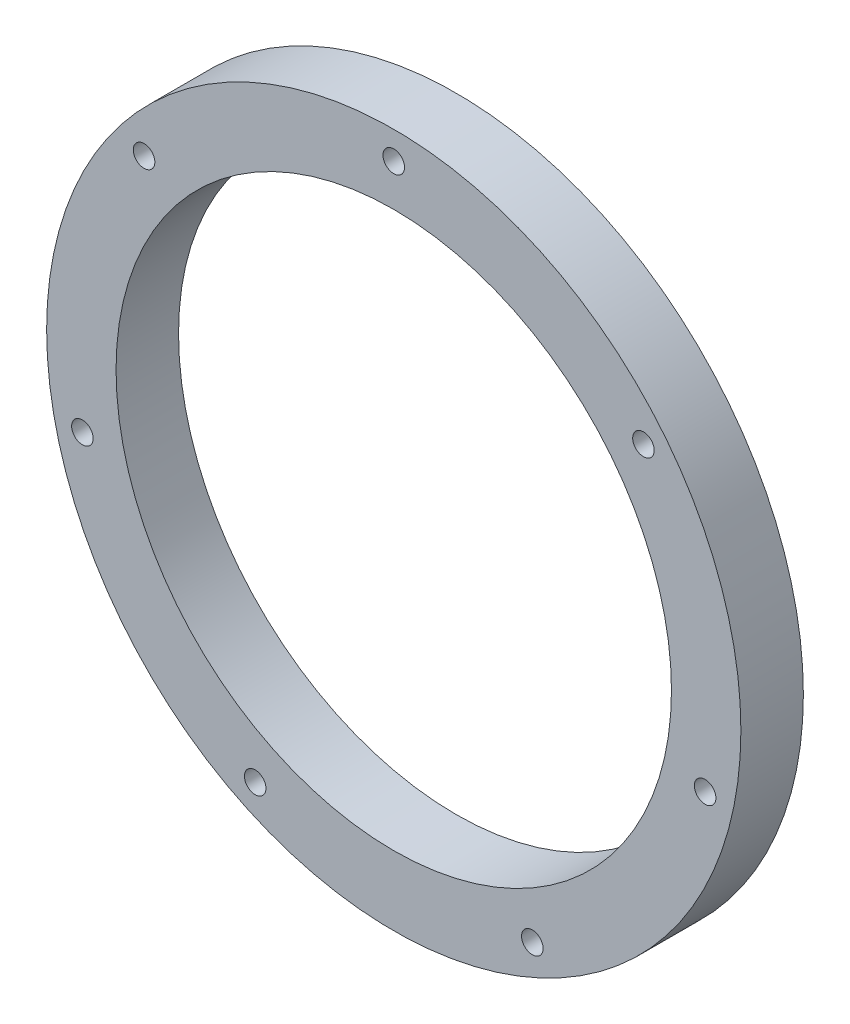
ISO-10303-21;
HEADER;
FILE_DESCRIPTION(('STEP AP214'),'2;1');
FILE_NAME('part.step','',(''),(''),'','','');
FILE_SCHEMA(('AUTOMOTIVE_DESIGN { 1 0 10303 214 1 1 1 1 }'));
ENDSEC;
DATA;
#1=APPLICATION_CONTEXT('core data for automotive mechanical design processes');
#2=APPLICATION_PROTOCOL_DEFINITION('international standard','automotive_design',2000,#1);
#3=PRODUCT_CONTEXT('',#1,'mechanical');
#4=PRODUCT('Part','Part','',(#3));
#5=PRODUCT_RELATED_PRODUCT_CATEGORY('part','',(#4));
#6=PRODUCT_DEFINITION_FORMATION('','',#4);
#7=PRODUCT_DEFINITION_CONTEXT('part definition',#1,'design');
#8=PRODUCT_DEFINITION('design','',#6,#7);
#9=PRODUCT_DEFINITION_SHAPE('','',#8);
#10=(LENGTH_UNIT() NAMED_UNIT(*) SI_UNIT(.MILLI.,.METRE.));
#11=(NAMED_UNIT(*) PLANE_ANGLE_UNIT() SI_UNIT($,.RADIAN.));
#12=(NAMED_UNIT(*) SI_UNIT($,.STERADIAN.) SOLID_ANGLE_UNIT());
#13=UNCERTAINTY_MEASURE_WITH_UNIT(LENGTH_MEASURE(1.E-05),#10,'distance_accuracy_value','');
#14=(GEOMETRIC_REPRESENTATION_CONTEXT(3) GLOBAL_UNCERTAINTY_ASSIGNED_CONTEXT((#13)) GLOBAL_UNIT_ASSIGNED_CONTEXT((#10,
#11,#12)) REPRESENTATION_CONTEXT('',''));
#15=CARTESIAN_POINT('',(0.,0.,0.));
#16=DIRECTION('',(0.,0.,1.));
#17=DIRECTION('',(1.,0.,0.));
#18=AXIS2_PLACEMENT_3D('',#15,#16,#17);
#19=CARTESIAN_POINT('',(0.,0.,9.));
#20=DIRECTION('',(0.,0.,1.));
#21=DIRECTION('',(1.,0.,0.));
#22=AXIS2_PLACEMENT_3D('',#19,#20,#21);
#23=PLANE('',#22);
#24=CARTESIAN_POINT('',(35.964248193529,28.6805308855022,9.));
#25=DIRECTION('',(0.,0.,1.));
#26=DIRECTION('',(1.,0.,0.));
#27=AXIS2_PLACEMENT_3D('',#24,#25,#26);
#28=CIRCLE('',#27,1.55);
#29=CARTESIAN_POINT('',(37.514248193529,28.6805308855022,9.));
#30=VERTEX_POINT('',#29);
#31=EDGE_CURVE('E58',#30,#30,#28,.T.);
#32=ORIENTED_EDGE('',*,*,#31,.F.);
#33=EDGE_LOOP('',(#32));
#34=FACE_BOUND('',#33,.T.);
#35=CARTESIAN_POINT('',(44.846683960364,-10.23596296199,9.));
#36=DIRECTION('',(0.,0.,1.));
#37=DIRECTION('',(1.,0.,0.));
#38=AXIS2_PLACEMENT_3D('',#35,#36,#37);
#39=CIRCLE('',#38,1.55);
#40=CARTESIAN_POINT('',(46.396683960364,-10.23596296199,9.));
#41=VERTEX_POINT('',#40);
#42=EDGE_CURVE('E95',#41,#41,#39,.T.);
#43=ORIENTED_EDGE('',*,*,#42,.F.);
#44=EDGE_LOOP('',(#43));
#45=FACE_BOUND('',#44,.T.);
#46=CARTESIAN_POINT('',(19.958651999408,-41.4445679235111,9.));
#47=DIRECTION('',(0.,0.,1.));
#48=DIRECTION('',(1.,0.,0.));
#49=AXIS2_PLACEMENT_3D('',#46,#47,#48);
#50=CIRCLE('',#49,1.55);
#51=CARTESIAN_POINT('',(21.508651999408,-41.4445679235111,9.));
#52=VERTEX_POINT('',#51);
#53=EDGE_CURVE('E92',#52,#52,#50,.T.);
#54=ORIENTED_EDGE('',*,*,#53,.F.);
#55=EDGE_LOOP('',(#54));
#56=FACE_BOUND('',#55,.T.);
#57=CARTESIAN_POINT('',(-19.9586519994074,-41.4445679235114,9.));
#58=DIRECTION('',(0.,0.,1.));
#59=DIRECTION('',(1.,0.,0.));
#60=AXIS2_PLACEMENT_3D('',#57,#58,#59);
#61=CIRCLE('',#60,1.55);
#62=CARTESIAN_POINT('',(-18.4086519994074,-41.4445679235114,9.));
#63=VERTEX_POINT('',#62);
#64=EDGE_CURVE('E98',#63,#63,#61,.T.);
#65=ORIENTED_EDGE('',*,*,#64,.F.);
#66=EDGE_LOOP('',(#65));
#67=FACE_BOUND('',#66,.T.);
#68=CARTESIAN_POINT('',(-44.8466839603638,-10.2359629619906,9.));
#69=DIRECTION('',(0.,0.,1.));
#70=DIRECTION('',(1.,0.,0.));
#71=AXIS2_PLACEMENT_3D('',#68,#69,#70);
#72=CIRCLE('',#71,1.55);
#73=CARTESIAN_POINT('',(-43.2966839603638,-10.2359629619906,9.));
#74=VERTEX_POINT('',#73);
#75=EDGE_CURVE('E101',#74,#74,#72,.T.);
#76=ORIENTED_EDGE('',*,*,#75,.F.);
#77=EDGE_LOOP('',(#76));
#78=FACE_BOUND('',#77,.T.);
#79=CARTESIAN_POINT('',(-35.9642481935294,28.6805308855017,9.));
#80=DIRECTION('',(0.,0.,1.));
#81=DIRECTION('',(1.,0.,0.));
#82=AXIS2_PLACEMENT_3D('',#79,#80,#81);
#83=CIRCLE('',#82,1.55);
#84=CARTESIAN_POINT('',(-34.4142481935294,28.6805308855017,9.));
#85=VERTEX_POINT('',#84);
#86=EDGE_CURVE('E102',#85,#85,#83,.T.);
#87=ORIENTED_EDGE('',*,*,#86,.F.);
#88=EDGE_LOOP('',(#87));
#89=FACE_BOUND('',#88,.T.);
#90=CARTESIAN_POINT('',(0.,46.,9.));
#91=DIRECTION('',(0.,0.,1.));
#92=DIRECTION('',(1.,0.,0.));
#93=AXIS2_PLACEMENT_3D('',#90,#91,#92);
#94=CIRCLE('',#93,1.55);
#95=CARTESIAN_POINT('',(1.55,46.,9.));
#96=VERTEX_POINT('',#95);
#97=EDGE_CURVE('E110',#96,#96,#94,.T.);
#98=ORIENTED_EDGE('',*,*,#97,.F.);
#99=EDGE_LOOP('',(#98));
#100=FACE_BOUND('',#99,.T.);
#101=CARTESIAN_POINT('',(0.,0.,9.));
#102=DIRECTION('',(0.,0.,1.));
#103=DIRECTION('',(1.,0.,0.));
#104=AXIS2_PLACEMENT_3D('',#101,#102,#103);
#105=CIRCLE('',#104,50.);
#106=CARTESIAN_POINT('',(50.,0.,9.));
#107=VERTEX_POINT('',#106);
#108=EDGE_CURVE('E10',#107,#107,#105,.T.);
#109=ORIENTED_EDGE('',*,*,#108,.T.);
#110=EDGE_LOOP('',(#109));
#111=FACE_BOUND('',#110,.T.);
#112=CARTESIAN_POINT('',(0.,0.,9.));
#113=DIRECTION('',(0.,0.,1.));
#114=DIRECTION('',(1.,0.,0.));
#115=AXIS2_PLACEMENT_3D('',#112,#113,#114);
#116=CIRCLE('',#115,40.);
#117=CARTESIAN_POINT('',(40.,0.,9.));
#118=VERTEX_POINT('',#117);
#119=EDGE_CURVE('E51',#118,#118,#116,.T.);
#120=ORIENTED_EDGE('',*,*,#119,.F.);
#121=EDGE_LOOP('',(#120));
#122=FACE_BOUND('',#121,.T.);
#123=ADVANCED_FACE('F36',(#34,#45,#56,#67,#78,#89,#100,#111,#122),#23,.T.);
#124=CARTESIAN_POINT('',(0.,0.,0.));
#125=DIRECTION('',(0.,0.,1.));
#126=DIRECTION('',(1.,0.,0.));
#127=AXIS2_PLACEMENT_3D('',#124,#125,#126);
#128=PLANE('',#127);
#129=CARTESIAN_POINT('',(35.964248193529,28.6805308855022,0.));
#130=DIRECTION('',(0.,0.,1.));
#131=DIRECTION('',(0.623489801858743,-0.781831482468022,0.));
#132=AXIS2_PLACEMENT_3D('',#129,#130,#131);
#133=CIRCLE('',#132,3.1);
#134=CARTESIAN_POINT('',(37.8970665792911,26.2568532898513,0.));
#135=VERTEX_POINT('',#134);
#136=EDGE_CURVE('E264',#135,#135,#133,.T.);
#137=ORIENTED_EDGE('',*,*,#136,.T.);
#138=EDGE_LOOP('',(#137));
#139=FACE_BOUND('',#138,.T.);
#140=CARTESIAN_POINT('',(44.846683960364,-10.23596296199,0.));
#141=DIRECTION('',(0.,0.,1.));
#142=DIRECTION('',(-0.222520933956305,-0.974927912181826,0.));
#143=AXIS2_PLACEMENT_3D('',#140,#141,#142);
#144=CIRCLE('',#143,3.1);
#145=CARTESIAN_POINT('',(44.1568690650994,-13.2582394897537,0.));
#146=VERTEX_POINT('',#145);
#147=EDGE_CURVE('E259',#146,#146,#144,.T.);
#148=ORIENTED_EDGE('',*,*,#147,.T.);
#149=EDGE_LOOP('',(#148));
#150=FACE_BOUND('',#149,.T.);
#151=CARTESIAN_POINT('',(19.958651999408,-41.4445679235111,0.));
#152=DIRECTION('',(0.,0.,1.));
#153=DIRECTION('',(-0.900968867902416,-0.433883739117565,0.));
#154=AXIS2_PLACEMENT_3D('',#151,#152,#153);
#155=CIRCLE('',#154,3.1);
#156=CARTESIAN_POINT('',(17.1656485089105,-42.7896075147756,0.));
#157=VERTEX_POINT('',#156);
#158=EDGE_CURVE('E251',#157,#157,#155,.T.);
#159=ORIENTED_EDGE('',*,*,#158,.T.);
#160=EDGE_LOOP('',(#159));
#161=FACE_BOUND('',#160,.T.);
#162=CARTESIAN_POINT('',(-19.9586519994074,-41.4445679235114,0.));
#163=DIRECTION('',(0.,0.,1.));
#164=DIRECTION('',(-0.900968867902422,0.433883739117553,0.));
#165=AXIS2_PLACEMENT_3D('',#162,#163,#164);
#166=CIRCLE('',#165,3.1);
#167=CARTESIAN_POINT('',(-22.7516554899049,-40.099528332247,0.));
#168=VERTEX_POINT('',#167);
#169=EDGE_CURVE('E246',#168,#168,#166,.T.);
#170=ORIENTED_EDGE('',*,*,#169,.T.);
#171=EDGE_LOOP('',(#170));
#172=FACE_BOUND('',#171,.T.);
#173=CARTESIAN_POINT('',(-44.8466839603638,-10.2359629619906,0.));
#174=DIRECTION('',(0.,0.,1.));
#175=DIRECTION('',(-0.222520933956318,0.974927912181823,0.));
#176=AXIS2_PLACEMENT_3D('',#173,#174,#175);
#177=CIRCLE('',#176,3.1);
#178=CARTESIAN_POINT('',(-45.5364988556284,-7.21368643422699,0.));
#179=VERTEX_POINT('',#178);
#180=EDGE_CURVE('E236',#179,#179,#177,.T.);
#181=ORIENTED_EDGE('',*,*,#180,.T.);
#182=EDGE_LOOP('',(#181));
#183=FACE_BOUND('',#182,.T.);
#184=CARTESIAN_POINT('',(-35.9642481935294,28.6805308855017,0.));
#185=DIRECTION('',(0.,0.,1.));
#186=DIRECTION('',(0.623489801858732,0.781831482468031,0.));
#187=AXIS2_PLACEMENT_3D('',#184,#185,#186);
#188=CIRCLE('',#187,3.1);
#189=CARTESIAN_POINT('',(-34.0314298077674,31.1042084811526,0.));
#190=VERTEX_POINT('',#189);
#191=EDGE_CURVE('E240',#190,#190,#188,.T.);
#192=ORIENTED_EDGE('',*,*,#191,.T.);
#193=EDGE_LOOP('',(#192));
#194=FACE_BOUND('',#193,.T.);
#195=CARTESIAN_POINT('',(0.,46.,0.));
#196=DIRECTION('',(0.,0.,1.));
#197=DIRECTION('',(1.,0.,0.));
#198=AXIS2_PLACEMENT_3D('',#195,#196,#197);
#199=CIRCLE('',#198,3.1);
#200=CARTESIAN_POINT('',(3.1,46.,0.));
#201=VERTEX_POINT('',#200);
#202=EDGE_CURVE('E77',#201,#201,#199,.T.);
#203=ORIENTED_EDGE('',*,*,#202,.T.);
#204=EDGE_LOOP('',(#203));
#205=FACE_BOUND('',#204,.T.);
#206=CARTESIAN_POINT('',(0.,0.,0.));
#207=DIRECTION('',(0.,0.,1.));
#208=DIRECTION('',(1.,0.,0.));
#209=AXIS2_PLACEMENT_3D('',#206,#207,#208);
#210=CIRCLE('',#209,50.);
#211=CARTESIAN_POINT('',(50.,0.,0.));
#212=VERTEX_POINT('',#211);
#213=EDGE_CURVE('E46',#212,#212,#210,.T.);
#214=ORIENTED_EDGE('',*,*,#213,.F.);
#215=EDGE_LOOP('',(#214));
#216=FACE_BOUND('',#215,.T.);
#217=CARTESIAN_POINT('',(0.,0.,0.));
#218=DIRECTION('',(0.,0.,1.));
#219=DIRECTION('',(1.,0.,0.));
#220=AXIS2_PLACEMENT_3D('',#217,#218,#219);
#221=CIRCLE('',#220,40.);
#222=CARTESIAN_POINT('',(40.,0.,0.));
#223=VERTEX_POINT('',#222);
#224=EDGE_CURVE('E53',#223,#223,#221,.T.);
#225=ORIENTED_EDGE('',*,*,#224,.T.);
#226=EDGE_LOOP('',(#225));
#227=FACE_BOUND('',#226,.T.);
#228=ADVANCED_FACE('F113',(#139,#150,#161,#172,#183,#194,#205,#216,#227),#128,.F.);
#229=CARTESIAN_POINT('',(0.,0.,9.));
#230=DIRECTION('',(0.,0.,-1.));
#231=DIRECTION('',(-1.,0.,0.));
#232=AXIS2_PLACEMENT_3D('',#229,#230,#231);
#233=CYLINDRICAL_SURFACE('',#232,50.);
#234=ORIENTED_EDGE('',*,*,#108,.F.);
#235=EDGE_LOOP('',(#234));
#236=FACE_BOUND('',#235,.T.);
#237=ORIENTED_EDGE('',*,*,#213,.T.);
#238=EDGE_LOOP('',(#237));
#239=FACE_BOUND('',#238,.T.);
#240=ADVANCED_FACE('F37',(#236,#239),#233,.T.);
#241=CARTESIAN_POINT('',(0.,0.,9.));
#242=DIRECTION('',(0.,0.,-1.));
#243=DIRECTION('',(-1.,0.,0.));
#244=AXIS2_PLACEMENT_3D('',#241,#242,#243);
#245=CYLINDRICAL_SURFACE('',#244,40.);
#246=ORIENTED_EDGE('',*,*,#119,.T.);
#247=EDGE_LOOP('',(#246));
#248=FACE_BOUND('',#247,.T.);
#249=ORIENTED_EDGE('',*,*,#224,.F.);
#250=EDGE_LOOP('',(#249));
#251=FACE_BOUND('',#250,.T.);
#252=ADVANCED_FACE('F120',(#248,#251),#245,.F.);
#253=CARTESIAN_POINT('',(0.,46.,9.));
#254=DIRECTION('',(0.,0.,1.));
#255=DIRECTION('',(1.,0.,0.));
#256=AXIS2_PLACEMENT_3D('',#253,#254,#255);
#257=CYLINDRICAL_SURFACE('',#256,1.55);
#258=CARTESIAN_POINT('',(0.,46.,3.3));
#259=DIRECTION('',(0.,0.,1.));
#260=DIRECTION('',(1.,0.,0.));
#261=AXIS2_PLACEMENT_3D('',#258,#259,#260);
#262=CIRCLE('',#261,1.55);
#263=CARTESIAN_POINT('',(1.55,46.,3.3));
#264=VERTEX_POINT('',#263);
#265=EDGE_CURVE('E60',#264,#264,#262,.F.);
#266=ORIENTED_EDGE('',*,*,#265,.T.);
#267=EDGE_LOOP('',(#266));
#268=FACE_BOUND('',#267,.T.);
#269=ORIENTED_EDGE('',*,*,#97,.T.);
#270=EDGE_LOOP('',(#269));
#271=FACE_BOUND('',#270,.T.);
#272=ADVANCED_FACE('F117',(#268,#271),#257,.F.);
#273=CARTESIAN_POINT('',(-35.9642481935294,28.6805308855017,9.));
#274=DIRECTION('',(0.,0.,1.));
#275=DIRECTION('',(1.,0.,0.));
#276=AXIS2_PLACEMENT_3D('',#273,#274,#275);
#277=CYLINDRICAL_SURFACE('',#276,1.55);
#278=CARTESIAN_POINT('',(-35.9642481935294,28.6805308855017,3.3));
#279=DIRECTION('',(0.,0.,1.));
#280=DIRECTION('',(1.,0.,0.));
#281=AXIS2_PLACEMENT_3D('',#278,#279,#280);
#282=CIRCLE('',#281,1.55);
#283=CARTESIAN_POINT('',(-34.4142481935294,28.6805308855017,3.3));
#284=VERTEX_POINT('',#283);
#285=EDGE_CURVE('E45',#284,#284,#282,.F.);
#286=ORIENTED_EDGE('',*,*,#285,.T.);
#287=EDGE_LOOP('',(#286));
#288=FACE_BOUND('',#287,.T.);
#289=ORIENTED_EDGE('',*,*,#86,.T.);
#290=EDGE_LOOP('',(#289));
#291=FACE_BOUND('',#290,.T.);
#292=ADVANCED_FACE('F127',(#288,#291),#277,.F.);
#293=CARTESIAN_POINT('',(-44.8466839603638,-10.2359629619906,9.));
#294=DIRECTION('',(0.,0.,1.));
#295=DIRECTION('',(1.,0.,0.));
#296=AXIS2_PLACEMENT_3D('',#293,#294,#295);
#297=CYLINDRICAL_SURFACE('',#296,1.55);
#298=CARTESIAN_POINT('',(-44.8466839603638,-10.2359629619906,3.3));
#299=DIRECTION('',(0.,0.,1.));
#300=DIRECTION('',(1.,0.,0.));
#301=AXIS2_PLACEMENT_3D('',#298,#299,#300);
#302=CIRCLE('',#301,1.55);
#303=CARTESIAN_POINT('',(-43.2966839603638,-10.2359629619906,3.3));
#304=VERTEX_POINT('',#303);
#305=EDGE_CURVE('E74',#304,#304,#302,.F.);
#306=ORIENTED_EDGE('',*,*,#305,.T.);
#307=EDGE_LOOP('',(#306));
#308=FACE_BOUND('',#307,.T.);
#309=ORIENTED_EDGE('',*,*,#75,.T.);
#310=EDGE_LOOP('',(#309));
#311=FACE_BOUND('',#310,.T.);
#312=ADVANCED_FACE('F153',(#308,#311),#297,.F.);
#313=CARTESIAN_POINT('',(-19.9586519994074,-41.4445679235114,9.));
#314=DIRECTION('',(0.,0.,1.));
#315=DIRECTION('',(1.,0.,0.));
#316=AXIS2_PLACEMENT_3D('',#313,#314,#315);
#317=CYLINDRICAL_SURFACE('',#316,1.55);
#318=CARTESIAN_POINT('',(-19.9586519994074,-41.4445679235114,3.3));
#319=DIRECTION('',(0.,0.,1.));
#320=DIRECTION('',(1.,0.,0.));
#321=AXIS2_PLACEMENT_3D('',#318,#319,#320);
#322=CIRCLE('',#321,1.55);
#323=CARTESIAN_POINT('',(-18.4086519994074,-41.4445679235114,3.3));
#324=VERTEX_POINT('',#323);
#325=EDGE_CURVE('E75',#324,#324,#322,.F.);
#326=ORIENTED_EDGE('',*,*,#325,.T.);
#327=EDGE_LOOP('',(#326));
#328=FACE_BOUND('',#327,.T.);
#329=ORIENTED_EDGE('',*,*,#64,.T.);
#330=EDGE_LOOP('',(#329));
#331=FACE_BOUND('',#330,.T.);
#332=ADVANCED_FACE('F158',(#328,#331),#317,.F.);
#333=CARTESIAN_POINT('',(19.958651999408,-41.4445679235111,9.));
#334=DIRECTION('',(0.,0.,1.));
#335=DIRECTION('',(1.,0.,0.));
#336=AXIS2_PLACEMENT_3D('',#333,#334,#335);
#337=CYLINDRICAL_SURFACE('',#336,1.55);
#338=CARTESIAN_POINT('',(19.958651999408,-41.4445679235111,3.3));
#339=DIRECTION('',(0.,0.,1.));
#340=DIRECTION('',(1.,0.,0.));
#341=AXIS2_PLACEMENT_3D('',#338,#339,#340);
#342=CIRCLE('',#341,1.55);
#343=CARTESIAN_POINT('',(21.508651999408,-41.4445679235111,3.3));
#344=VERTEX_POINT('',#343);
#345=EDGE_CURVE('E68',#344,#344,#342,.F.);
#346=ORIENTED_EDGE('',*,*,#345,.T.);
#347=EDGE_LOOP('',(#346));
#348=FACE_BOUND('',#347,.T.);
#349=ORIENTED_EDGE('',*,*,#53,.T.);
#350=EDGE_LOOP('',(#349));
#351=FACE_BOUND('',#350,.T.);
#352=ADVANCED_FACE('F162',(#348,#351),#337,.F.);
#353=CARTESIAN_POINT('',(44.846683960364,-10.23596296199,9.));
#354=DIRECTION('',(0.,0.,1.));
#355=DIRECTION('',(1.,0.,0.));
#356=AXIS2_PLACEMENT_3D('',#353,#354,#355);
#357=CYLINDRICAL_SURFACE('',#356,1.55);
#358=CARTESIAN_POINT('',(44.846683960364,-10.23596296199,3.3));
#359=DIRECTION('',(0.,0.,1.));
#360=DIRECTION('',(1.,0.,0.));
#361=AXIS2_PLACEMENT_3D('',#358,#359,#360);
#362=CIRCLE('',#361,1.55);
#363=CARTESIAN_POINT('',(46.396683960364,-10.23596296199,3.3));
#364=VERTEX_POINT('',#363);
#365=EDGE_CURVE('E64',#364,#364,#362,.F.);
#366=ORIENTED_EDGE('',*,*,#365,.T.);
#367=EDGE_LOOP('',(#366));
#368=FACE_BOUND('',#367,.T.);
#369=ORIENTED_EDGE('',*,*,#42,.T.);
#370=EDGE_LOOP('',(#369));
#371=FACE_BOUND('',#370,.T.);
#372=ADVANCED_FACE('F170',(#368,#371),#357,.F.);
#373=CARTESIAN_POINT('',(35.964248193529,28.6805308855022,9.));
#374=DIRECTION('',(0.,0.,1.));
#375=DIRECTION('',(1.,0.,0.));
#376=AXIS2_PLACEMENT_3D('',#373,#374,#375);
#377=CYLINDRICAL_SURFACE('',#376,1.55);
#378=CARTESIAN_POINT('',(35.964248193529,28.6805308855022,3.3));
#379=DIRECTION('',(0.,0.,1.));
#380=DIRECTION('',(1.,0.,0.));
#381=AXIS2_PLACEMENT_3D('',#378,#379,#380);
#382=CIRCLE('',#381,1.55);
#383=CARTESIAN_POINT('',(37.514248193529,28.6805308855022,3.3));
#384=VERTEX_POINT('',#383);
#385=EDGE_CURVE('E65',#384,#384,#382,.F.);
#386=ORIENTED_EDGE('',*,*,#385,.T.);
#387=EDGE_LOOP('',(#386));
#388=FACE_BOUND('',#387,.T.);
#389=ORIENTED_EDGE('',*,*,#31,.T.);
#390=EDGE_LOOP('',(#389));
#391=FACE_BOUND('',#390,.T.);
#392=ADVANCED_FACE('F173',(#388,#391),#377,.F.);
#393=CARTESIAN_POINT('',(0.,46.,3.3));
#394=DIRECTION('',(0.,0.,1.));
#395=DIRECTION('',(1.,0.,0.));
#396=AXIS2_PLACEMENT_3D('',#393,#394,#395);
#397=PLANE('',#396);
#398=CARTESIAN_POINT('',(0.,46.,3.3));
#399=DIRECTION('',(0.,0.,1.));
#400=DIRECTION('',(1.,0.,0.));
#401=AXIS2_PLACEMENT_3D('',#398,#399,#400);
#402=CIRCLE('',#401,3.1);
#403=CARTESIAN_POINT('',(3.1,46.,3.3));
#404=VERTEX_POINT('',#403);
#405=EDGE_CURVE('E63',#404,#404,#402,.T.);
#406=ORIENTED_EDGE('',*,*,#405,.F.);
#407=EDGE_LOOP('',(#406));
#408=FACE_BOUND('',#407,.T.);
#409=ORIENTED_EDGE('',*,*,#265,.F.);
#410=EDGE_LOOP('',(#409));
#411=FACE_BOUND('',#410,.T.);
#412=ADVANCED_FACE('F174',(#408,#411),#397,.F.);
#413=CARTESIAN_POINT('',(0.,46.,3.3));
#414=DIRECTION('',(0.,0.,-1.));
#415=DIRECTION('',(-1.,0.,0.));
#416=AXIS2_PLACEMENT_3D('',#413,#414,#415);
#417=CYLINDRICAL_SURFACE('',#416,3.1);
#418=ORIENTED_EDGE('',*,*,#405,.T.);
#419=EDGE_LOOP('',(#418));
#420=FACE_BOUND('',#419,.T.);
#421=ORIENTED_EDGE('',*,*,#202,.F.);
#422=EDGE_LOOP('',(#421));
#423=FACE_BOUND('',#422,.T.);
#424=ADVANCED_FACE('F176',(#420,#423),#417,.F.);
#425=CARTESIAN_POINT('',(35.964248193529,28.6805308855022,3.3));
#426=DIRECTION('',(0.,0.,1.));
#427=DIRECTION('',(0.623489801858743,-0.781831482468022,0.));
#428=AXIS2_PLACEMENT_3D('',#425,#426,#427);
#429=PLANE('',#428);
#430=CARTESIAN_POINT('',(35.964248193529,28.6805308855022,3.3));
#431=DIRECTION('',(0.,0.,1.));
#432=DIRECTION('',(0.623489801858743,-0.781831482468022,0.));
#433=AXIS2_PLACEMENT_3D('',#430,#431,#432);
#434=CIRCLE('',#433,3.1);
#435=CARTESIAN_POINT('',(37.8970665792911,26.2568532898513,3.3));
#436=VERTEX_POINT('',#435);
#437=EDGE_CURVE('E265',#436,#436,#434,.T.);
#438=ORIENTED_EDGE('',*,*,#437,.F.);
#439=EDGE_LOOP('',(#438));
#440=FACE_BOUND('',#439,.T.);
#441=ORIENTED_EDGE('',*,*,#385,.F.);
#442=EDGE_LOOP('',(#441));
#443=FACE_BOUND('',#442,.T.);
#444=ADVANCED_FACE('F177',(#440,#443),#429,.F.);
#445=CARTESIAN_POINT('',(35.964248193529,28.6805308855022,3.3));
#446=DIRECTION('',(0.,0.,-1.));
#447=DIRECTION('',(-1.,0.,0.));
#448=AXIS2_PLACEMENT_3D('',#445,#446,#447);
#449=CYLINDRICAL_SURFACE('',#448,3.1);
#450=ORIENTED_EDGE('',*,*,#437,.T.);
#451=EDGE_LOOP('',(#450));
#452=FACE_BOUND('',#451,.T.);
#453=ORIENTED_EDGE('',*,*,#136,.F.);
#454=EDGE_LOOP('',(#453));
#455=FACE_BOUND('',#454,.T.);
#456=ADVANCED_FACE('F193',(#452,#455),#449,.F.);
#457=CARTESIAN_POINT('',(44.846683960364,-10.23596296199,3.3));
#458=DIRECTION('',(0.,0.,1.));
#459=DIRECTION('',(-0.222520933956305,-0.974927912181826,0.));
#460=AXIS2_PLACEMENT_3D('',#457,#458,#459);
#461=PLANE('',#460);
#462=CARTESIAN_POINT('',(44.846683960364,-10.23596296199,3.3));
#463=DIRECTION('',(0.,0.,1.));
#464=DIRECTION('',(-0.222520933956305,-0.974927912181826,0.));
#465=AXIS2_PLACEMENT_3D('',#462,#463,#464);
#466=CIRCLE('',#465,3.1);
#467=CARTESIAN_POINT('',(44.1568690650994,-13.2582394897537,3.3));
#468=VERTEX_POINT('',#467);
#469=EDGE_CURVE('E258',#468,#468,#466,.T.);
#470=ORIENTED_EDGE('',*,*,#469,.F.);
#471=EDGE_LOOP('',(#470));
#472=FACE_BOUND('',#471,.T.);
#473=ORIENTED_EDGE('',*,*,#365,.F.);
#474=EDGE_LOOP('',(#473));
#475=FACE_BOUND('',#474,.T.);
#476=ADVANCED_FACE('F197',(#472,#475),#461,.F.);
#477=CARTESIAN_POINT('',(44.846683960364,-10.23596296199,3.3));
#478=DIRECTION('',(0.,0.,-1.));
#479=DIRECTION('',(-1.,0.,0.));
#480=AXIS2_PLACEMENT_3D('',#477,#478,#479);
#481=CYLINDRICAL_SURFACE('',#480,3.1);
#482=ORIENTED_EDGE('',*,*,#469,.T.);
#483=EDGE_LOOP('',(#482));
#484=FACE_BOUND('',#483,.T.);
#485=ORIENTED_EDGE('',*,*,#147,.F.);
#486=EDGE_LOOP('',(#485));
#487=FACE_BOUND('',#486,.T.);
#488=ADVANCED_FACE('F205',(#484,#487),#481,.F.);
#489=CARTESIAN_POINT('',(19.958651999408,-41.4445679235111,3.3));
#490=DIRECTION('',(0.,0.,1.));
#491=DIRECTION('',(-0.900968867902416,-0.433883739117565,0.));
#492=AXIS2_PLACEMENT_3D('',#489,#490,#491);
#493=PLANE('',#492);
#494=CARTESIAN_POINT('',(19.958651999408,-41.4445679235111,3.3));
#495=DIRECTION('',(0.,0.,1.));
#496=DIRECTION('',(-0.900968867902416,-0.433883739117565,0.));
#497=AXIS2_PLACEMENT_3D('',#494,#495,#496);
#498=CIRCLE('',#497,3.1);
#499=CARTESIAN_POINT('',(17.1656485089105,-42.7896075147756,3.3));
#500=VERTEX_POINT('',#499);
#501=EDGE_CURVE('E247',#500,#500,#498,.T.);
#502=ORIENTED_EDGE('',*,*,#501,.F.);
#503=EDGE_LOOP('',(#502));
#504=FACE_BOUND('',#503,.T.);
#505=ORIENTED_EDGE('',*,*,#345,.F.);
#506=EDGE_LOOP('',(#505));
#507=FACE_BOUND('',#506,.T.);
#508=ADVANCED_FACE('F202',(#504,#507),#493,.F.);
#509=CARTESIAN_POINT('',(19.958651999408,-41.4445679235111,3.3));
#510=DIRECTION('',(0.,0.,-1.));
#511=DIRECTION('',(-1.,0.,0.));
#512=AXIS2_PLACEMENT_3D('',#509,#510,#511);
#513=CYLINDRICAL_SURFACE('',#512,3.1);
#514=ORIENTED_EDGE('',*,*,#501,.T.);
#515=EDGE_LOOP('',(#514));
#516=FACE_BOUND('',#515,.T.);
#517=ORIENTED_EDGE('',*,*,#158,.F.);
#518=EDGE_LOOP('',(#517));
#519=FACE_BOUND('',#518,.T.);
#520=ADVANCED_FACE('F209',(#516,#519),#513,.F.);
#521=CARTESIAN_POINT('',(-19.9586519994074,-41.4445679235114,3.3));
#522=DIRECTION('',(0.,0.,1.));
#523=DIRECTION('',(-0.900968867902422,0.433883739117553,0.));
#524=AXIS2_PLACEMENT_3D('',#521,#522,#523);
#525=PLANE('',#524);
#526=CARTESIAN_POINT('',(-19.9586519994074,-41.4445679235114,3.3));
#527=DIRECTION('',(0.,0.,1.));
#528=DIRECTION('',(-0.900968867902422,0.433883739117553,0.));
#529=AXIS2_PLACEMENT_3D('',#526,#527,#528);
#530=CIRCLE('',#529,3.1);
#531=CARTESIAN_POINT('',(-22.7516554899049,-40.099528332247,3.3));
#532=VERTEX_POINT('',#531);
#533=EDGE_CURVE('E245',#532,#532,#530,.T.);
#534=ORIENTED_EDGE('',*,*,#533,.F.);
#535=EDGE_LOOP('',(#534));
#536=FACE_BOUND('',#535,.T.);
#537=ORIENTED_EDGE('',*,*,#325,.F.);
#538=EDGE_LOOP('',(#537));
#539=FACE_BOUND('',#538,.T.);
#540=ADVANCED_FACE('F213',(#536,#539),#525,.F.);
#541=CARTESIAN_POINT('',(-19.9586519994074,-41.4445679235114,3.3));
#542=DIRECTION('',(0.,0.,-1.));
#543=DIRECTION('',(-1.,0.,0.));
#544=AXIS2_PLACEMENT_3D('',#541,#542,#543);
#545=CYLINDRICAL_SURFACE('',#544,3.1);
#546=ORIENTED_EDGE('',*,*,#533,.T.);
#547=EDGE_LOOP('',(#546));
#548=FACE_BOUND('',#547,.T.);
#549=ORIENTED_EDGE('',*,*,#169,.F.);
#550=EDGE_LOOP('',(#549));
#551=FACE_BOUND('',#550,.T.);
#552=ADVANCED_FACE('F217',(#548,#551),#545,.F.);
#553=CARTESIAN_POINT('',(-44.8466839603638,-10.2359629619906,3.3));
#554=DIRECTION('',(0.,0.,1.));
#555=DIRECTION('',(-0.222520933956318,0.974927912181823,0.));
#556=AXIS2_PLACEMENT_3D('',#553,#554,#555);
#557=PLANE('',#556);
#558=CARTESIAN_POINT('',(-44.8466839603638,-10.2359629619906,3.3));
#559=DIRECTION('',(0.,0.,1.));
#560=DIRECTION('',(-0.222520933956318,0.974927912181823,0.));
#561=AXIS2_PLACEMENT_3D('',#558,#559,#560);
#562=CIRCLE('',#561,3.1);
#563=CARTESIAN_POINT('',(-45.5364988556284,-7.21368643422699,3.3));
#564=VERTEX_POINT('',#563);
#565=EDGE_CURVE('E237',#564,#564,#562,.T.);
#566=ORIENTED_EDGE('',*,*,#565,.F.);
#567=EDGE_LOOP('',(#566));
#568=FACE_BOUND('',#567,.T.);
#569=ORIENTED_EDGE('',*,*,#305,.F.);
#570=EDGE_LOOP('',(#569));
#571=FACE_BOUND('',#570,.T.);
#572=ADVANCED_FACE('F222',(#568,#571),#557,.F.);
#573=CARTESIAN_POINT('',(-44.8466839603638,-10.2359629619906,3.3));
#574=DIRECTION('',(0.,0.,-1.));
#575=DIRECTION('',(-1.,0.,0.));
#576=AXIS2_PLACEMENT_3D('',#573,#574,#575);
#577=CYLINDRICAL_SURFACE('',#576,3.1);
#578=ORIENTED_EDGE('',*,*,#565,.T.);
#579=EDGE_LOOP('',(#578));
#580=FACE_BOUND('',#579,.T.);
#581=ORIENTED_EDGE('',*,*,#180,.F.);
#582=EDGE_LOOP('',(#581));
#583=FACE_BOUND('',#582,.T.);
#584=ADVANCED_FACE('F191',(#580,#583),#577,.F.);
#585=CARTESIAN_POINT('',(-35.9642481935294,28.6805308855017,3.3));
#586=DIRECTION('',(0.,0.,1.));
#587=DIRECTION('',(0.623489801858732,0.781831482468031,0.));
#588=AXIS2_PLACEMENT_3D('',#585,#586,#587);
#589=PLANE('',#588);
#590=CARTESIAN_POINT('',(-35.9642481935294,28.6805308855017,3.3));
#591=DIRECTION('',(0.,0.,1.));
#592=DIRECTION('',(0.623489801858732,0.781831482468031,0.));
#593=AXIS2_PLACEMENT_3D('',#590,#591,#592);
#594=CIRCLE('',#593,3.1);
#595=CARTESIAN_POINT('',(-34.0314298077674,31.1042084811526,3.3));
#596=VERTEX_POINT('',#595);
#597=EDGE_CURVE('E69',#596,#596,#594,.T.);
#598=ORIENTED_EDGE('',*,*,#597,.F.);
#599=EDGE_LOOP('',(#598));
#600=FACE_BOUND('',#599,.T.);
#601=ORIENTED_EDGE('',*,*,#285,.F.);
#602=EDGE_LOOP('',(#601));
#603=FACE_BOUND('',#602,.T.);
#604=ADVANCED_FACE('F186',(#600,#603),#589,.F.);
#605=CARTESIAN_POINT('',(-35.9642481935294,28.6805308855017,3.3));
#606=DIRECTION('',(0.,0.,-1.));
#607=DIRECTION('',(-1.,0.,0.));
#608=AXIS2_PLACEMENT_3D('',#605,#606,#607);
#609=CYLINDRICAL_SURFACE('',#608,3.1);
#610=ORIENTED_EDGE('',*,*,#597,.T.);
#611=EDGE_LOOP('',(#610));
#612=FACE_BOUND('',#611,.T.);
#613=ORIENTED_EDGE('',*,*,#191,.F.);
#614=EDGE_LOOP('',(#613));
#615=FACE_BOUND('',#614,.T.);
#616=ADVANCED_FACE('F183',(#612,#615),#609,.F.);
#617=CLOSED_SHELL('',(#123,#228,#240,#252,#272,#292,#312,#332,#352,#372,#392,#412,#424,#444,
#456,#476,#488,#508,#520,#540,#552,#572,#584,#604,#616));
#618=MANIFOLD_SOLID_BREP('B2',#617);
#619=ADVANCED_BREP_SHAPE_REPRESENTATION('',(#18,#618),#14);
#620=SHAPE_DEFINITION_REPRESENTATION(#9,#619);
ENDSEC;
END-ISO-10303-21;
